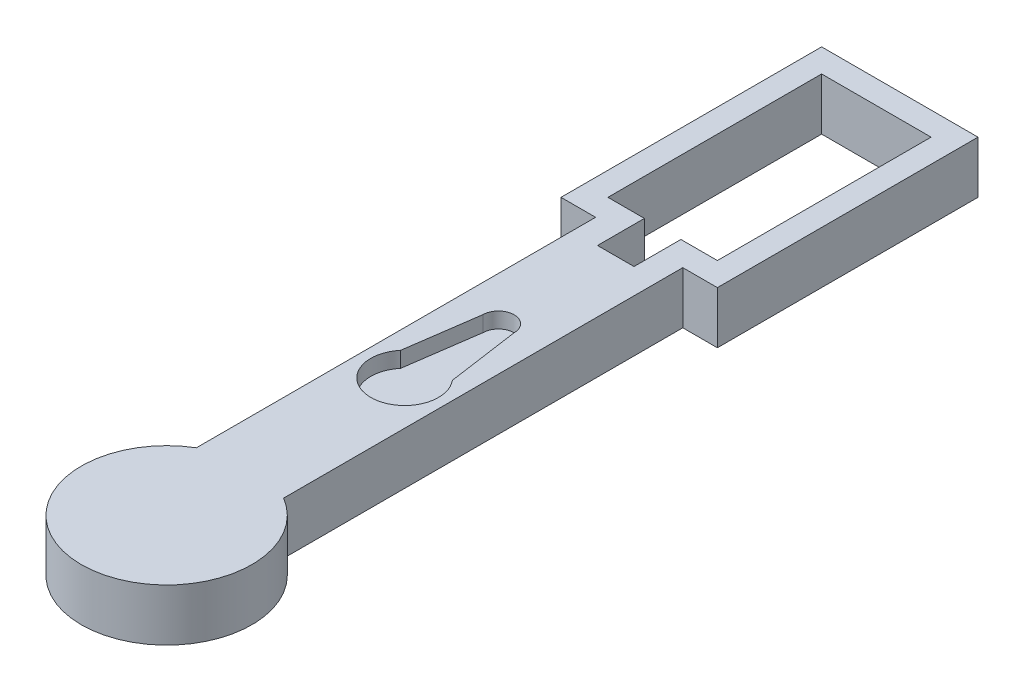
ISO-10303-21;
HEADER;
FILE_DESCRIPTION(('STEP AP214'),'2;1');
FILE_NAME('part.step','',(''),(''),'','','');
FILE_SCHEMA(('AUTOMOTIVE_DESIGN { 1 0 10303 214 1 1 1 1 }'));
ENDSEC;
DATA;
#1=APPLICATION_CONTEXT('core data for automotive mechanical design processes');
#2=APPLICATION_PROTOCOL_DEFINITION('international standard','automotive_design',2000,#1);
#3=PRODUCT_CONTEXT('',#1,'mechanical');
#4=PRODUCT('Part','Part','',(#3));
#5=PRODUCT_RELATED_PRODUCT_CATEGORY('part','',(#4));
#6=PRODUCT_DEFINITION_FORMATION('','',#4);
#7=PRODUCT_DEFINITION_CONTEXT('part definition',#1,'design');
#8=PRODUCT_DEFINITION('design','',#6,#7);
#9=PRODUCT_DEFINITION_SHAPE('','',#8);
#10=(LENGTH_UNIT() NAMED_UNIT(*) SI_UNIT(.MILLI.,.METRE.));
#11=(NAMED_UNIT(*) PLANE_ANGLE_UNIT() SI_UNIT($,.RADIAN.));
#12=(NAMED_UNIT(*) SI_UNIT($,.STERADIAN.) SOLID_ANGLE_UNIT());
#13=UNCERTAINTY_MEASURE_WITH_UNIT(LENGTH_MEASURE(1.E-05),#10,'distance_accuracy_value','');
#14=(GEOMETRIC_REPRESENTATION_CONTEXT(3) GLOBAL_UNCERTAINTY_ASSIGNED_CONTEXT((#13)) GLOBAL_UNIT_ASSIGNED_CONTEXT((#10,
#11,#12)) REPRESENTATION_CONTEXT('',''));
#15=CARTESIAN_POINT('',(0.,0.,0.));
#16=DIRECTION('',(0.,0.,1.));
#17=DIRECTION('',(1.,0.,0.));
#18=AXIS2_PLACEMENT_3D('',#15,#16,#17);
#19=CARTESIAN_POINT('',(8.36378985522402,10.,0.));
#20=DIRECTION('',(1.,0.,0.));
#21=DIRECTION('',(0.,0.,-1.));
#22=AXIS2_PLACEMENT_3D('',#19,#20,#21);
#23=PLANE('',#22);
#24=DIRECTION('',(0.,0.,1.));
#25=VECTOR('',#24,1.);
#26=CARTESIAN_POINT('',(8.36378985522402,0.,0.));
#27=LINE('',#26,#25);
#28=CARTESIAN_POINT('',(8.36378985522401,0.,-45.));
#29=VERTEX_POINT('',#28);
#30=CARTESIAN_POINT('',(8.36378985522402,0.,31.5906404654635));
#31=VERTEX_POINT('',#30);
#32=EDGE_CURVE('E285',#29,#31,#27,.T.);
#33=ORIENTED_EDGE('',*,*,#32,.F.);
#34=DIRECTION('',(0.,-1.,0.));
#35=VECTOR('',#34,1.);
#36=CARTESIAN_POINT('',(8.36378985522401,10.,-45.));
#37=LINE('',#36,#35);
#38=CARTESIAN_POINT('',(8.36378985522401,10.,-45.));
#39=VERTEX_POINT('',#38);
#40=EDGE_CURVE('E57',#39,#29,#37,.T.);
#41=ORIENTED_EDGE('',*,*,#40,.F.);
#42=DIRECTION('',(0.,0.,1.));
#43=VECTOR('',#42,1.);
#44=CARTESIAN_POINT('',(8.36378985522402,10.,0.));
#45=LINE('',#44,#43);
#46=CARTESIAN_POINT('',(8.36378985522402,10.,31.5906404654635));
#47=VERTEX_POINT('',#46);
#48=EDGE_CURVE('E277',#39,#47,#45,.T.);
#49=ORIENTED_EDGE('',*,*,#48,.T.);
#50=DIRECTION('',(0.,-1.,0.));
#51=VECTOR('',#50,1.);
#52=CARTESIAN_POINT('',(8.36378985522402,10.,31.5906404654635));
#53=LINE('',#52,#51);
#54=EDGE_CURVE('E12',#47,#31,#53,.T.);
#55=ORIENTED_EDGE('',*,*,#54,.T.);
#56=EDGE_LOOP('',(#33,#41,#49,#55));
#57=FACE_BOUND('',#56,.T.);
#58=ADVANCED_FACE('F48',(#57),#23,.T.);
#59=CARTESIAN_POINT('',(-8.36378985522402,10.,0.));
#60=DIRECTION('',(1.,0.,0.));
#61=DIRECTION('',(0.,0.,-1.));
#62=AXIS2_PLACEMENT_3D('',#59,#60,#61);
#63=PLANE('',#62);
#64=DIRECTION('',(0.,0.,1.));
#65=VECTOR('',#64,1.);
#66=CARTESIAN_POINT('',(-8.36378985522402,0.,0.));
#67=LINE('',#66,#65);
#68=CARTESIAN_POINT('',(-8.36378985522402,0.,-45.));
#69=VERTEX_POINT('',#68);
#70=CARTESIAN_POINT('',(-8.36378985522402,0.,31.5906404654635));
#71=VERTEX_POINT('',#70);
#72=EDGE_CURVE('E281',#69,#71,#67,.T.);
#73=ORIENTED_EDGE('',*,*,#72,.T.);
#74=DIRECTION('',(0.,-1.,0.));
#75=VECTOR('',#74,1.);
#76=CARTESIAN_POINT('',(-8.36378985522402,10.,31.5906404654635));
#77=LINE('',#76,#75);
#78=CARTESIAN_POINT('',(-8.36378985522402,10.,31.5906404654635));
#79=VERTEX_POINT('',#78);
#80=EDGE_CURVE('E284',#79,#71,#77,.T.);
#81=ORIENTED_EDGE('',*,*,#80,.F.);
#82=DIRECTION('',(0.,0.,1.));
#83=VECTOR('',#82,1.);
#84=CARTESIAN_POINT('',(-8.36378985522402,10.,0.));
#85=LINE('',#84,#83);
#86=CARTESIAN_POINT('',(-8.36378985522402,10.,-45.));
#87=VERTEX_POINT('',#86);
#88=EDGE_CURVE('E280',#87,#79,#85,.T.);
#89=ORIENTED_EDGE('',*,*,#88,.F.);
#90=DIRECTION('',(0.,-1.,0.));
#91=VECTOR('',#90,1.);
#92=CARTESIAN_POINT('',(-8.36378985522402,10.,-45.));
#93=LINE('',#92,#91);
#94=EDGE_CURVE('E292',#87,#69,#93,.T.);
#95=ORIENTED_EDGE('',*,*,#94,.T.);
#96=EDGE_LOOP('',(#73,#81,#89,#95));
#97=FACE_BOUND('',#96,.T.);
#98=ADVANCED_FACE('F360',(#97),#63,.F.);
#99=CARTESIAN_POINT('',(0.,0.,0.));
#100=DIRECTION('',(0.,1.,0.));
#101=DIRECTION('',(0.,0.,1.));
#102=AXIS2_PLACEMENT_3D('',#99,#100,#101);
#103=PLANE('',#102);
#104=DIRECTION('',(1.,0.,0.));
#105=VECTOR('',#104,1.);
#106=CARTESIAN_POINT('',(0.,0.,-40.5));
#107=LINE('',#106,#105);
#108=CARTESIAN_POINT('',(-3.50000000000001,0.,-40.5));
#109=VERTEX_POINT('',#108);
#110=CARTESIAN_POINT('',(3.49999999999999,0.,-40.5));
#111=VERTEX_POINT('',#110);
#112=EDGE_CURVE('E406',#109,#111,#107,.T.);
#113=ORIENTED_EDGE('',*,*,#112,.T.);
#114=DIRECTION('',(0.,0.,1.));
#115=VECTOR('',#114,1.);
#116=CARTESIAN_POINT('',(3.49999999999999,0.,0.));
#117=LINE('',#116,#115);
#118=CARTESIAN_POINT('',(3.49999999999999,0.,-49.5));
#119=VERTEX_POINT('',#118);
#120=EDGE_CURVE('E242',#119,#111,#117,.T.);
#121=ORIENTED_EDGE('',*,*,#120,.F.);
#122=DIRECTION('',(-1.,0.,0.));
#123=VECTOR('',#122,1.);
#124=CARTESIAN_POINT('',(10.5,0.,-49.5));
#125=LINE('',#124,#123);
#126=CARTESIAN_POINT('',(10.5,0.,-49.5));
#127=VERTEX_POINT('',#126);
#128=EDGE_CURVE('E194',#127,#119,#125,.T.);
#129=ORIENTED_EDGE('',*,*,#128,.F.);
#130=DIRECTION('',(0.,0.,1.));
#131=VECTOR('',#130,1.);
#132=CARTESIAN_POINT('',(10.5,0.,-90.5));
#133=LINE('',#132,#131);
#134=CARTESIAN_POINT('',(10.5,0.,-90.5));
#135=VERTEX_POINT('',#134);
#136=EDGE_CURVE('E231',#135,#127,#133,.T.);
#137=ORIENTED_EDGE('',*,*,#136,.F.);
#138=DIRECTION('',(-1.,0.,0.));
#139=VECTOR('',#138,1.);
#140=CARTESIAN_POINT('',(10.5,0.,-90.5));
#141=LINE('',#140,#139);
#142=CARTESIAN_POINT('',(-10.5,0.,-90.5));
#143=VERTEX_POINT('',#142);
#144=EDGE_CURVE('E223',#135,#143,#141,.T.);
#145=ORIENTED_EDGE('',*,*,#144,.T.);
#146=DIRECTION('',(0.,0.,1.));
#147=VECTOR('',#146,1.);
#148=CARTESIAN_POINT('',(-10.5,0.,-90.5));
#149=LINE('',#148,#147);
#150=CARTESIAN_POINT('',(-10.5,0.,-49.5));
#151=VERTEX_POINT('',#150);
#152=EDGE_CURVE('E226',#143,#151,#149,.T.);
#153=ORIENTED_EDGE('',*,*,#152,.T.);
#154=CARTESIAN_POINT('',(-3.50000000000001,0.,-49.5));
#155=VERTEX_POINT('',#154);
#156=EDGE_CURVE('E229',#155,#151,#125,.T.);
#157=ORIENTED_EDGE('',*,*,#156,.F.);
#158=DIRECTION('',(0.,0.,1.));
#159=VECTOR('',#158,1.);
#160=CARTESIAN_POINT('',(-3.50000000000001,0.,0.));
#161=LINE('',#160,#159);
#162=EDGE_CURVE('E65',#155,#109,#161,.T.);
#163=ORIENTED_EDGE('',*,*,#162,.T.);
#164=EDGE_LOOP('',(#113,#121,#129,#137,#145,#153,#157,#163));
#165=FACE_BOUND('',#164,.T.);
#166=ORIENTED_EDGE('',*,*,#32,.T.);
#167=CARTESIAN_POINT('',(0.,0.,45.6690209059487));
#168=DIRECTION('',(0.,1.,0.));
#169=DIRECTION('',(0.,0.,1.));
#170=AXIS2_PLACEMENT_3D('',#167,#168,#169);
#171=CIRCLE('',#170,16.3754015697138);
#172=EDGE_CURVE('E297',#71,#31,#171,.T.);
#173=ORIENTED_EDGE('',*,*,#172,.F.);
#174=ORIENTED_EDGE('',*,*,#72,.F.);
#175=DIRECTION('',(1.,0.,0.));
#176=VECTOR('',#175,1.);
#177=CARTESIAN_POINT('',(-15.,0.,-45.));
#178=LINE('',#177,#176);
#179=CARTESIAN_POINT('',(-15.,0.,-45.));
#180=VERTEX_POINT('',#179);
#181=EDGE_CURVE('E318',#180,#69,#178,.T.);
#182=ORIENTED_EDGE('',*,*,#181,.F.);
#183=DIRECTION('',(0.,0.,1.));
#184=VECTOR('',#183,1.);
#185=CARTESIAN_POINT('',(-15.,0.,-95.));
#186=LINE('',#185,#184);
#187=CARTESIAN_POINT('',(-15.,0.,-95.));
#188=VERTEX_POINT('',#187);
#189=EDGE_CURVE('E270',#188,#180,#186,.T.);
#190=ORIENTED_EDGE('',*,*,#189,.F.);
#191=DIRECTION('',(1.,0.,0.));
#192=VECTOR('',#191,1.);
#193=CARTESIAN_POINT('',(-15.,0.,-95.));
#194=LINE('',#193,#192);
#195=CARTESIAN_POINT('',(15.,0.,-95.));
#196=VERTEX_POINT('',#195);
#197=EDGE_CURVE('E304',#188,#196,#194,.T.);
#198=ORIENTED_EDGE('',*,*,#197,.T.);
#199=DIRECTION('',(0.,0.,1.));
#200=VECTOR('',#199,1.);
#201=CARTESIAN_POINT('',(15.,0.,-95.));
#202=LINE('',#201,#200);
#203=CARTESIAN_POINT('',(15.,0.,-45.));
#204=VERTEX_POINT('',#203);
#205=EDGE_CURVE('E321',#196,#204,#202,.T.);
#206=ORIENTED_EDGE('',*,*,#205,.T.);
#207=EDGE_CURVE('E317',#29,#204,#178,.T.);
#208=ORIENTED_EDGE('',*,*,#207,.F.);
#209=EDGE_LOOP('',(#166,#173,#174,#182,#190,#198,#206,#208));
#210=FACE_BOUND('',#209,.T.);
#211=ADVANCED_FACE('F343',(#165,#210),#103,.F.);
#212=CARTESIAN_POINT('',(0.,10.,0.));
#213=DIRECTION('',(0.,1.,0.));
#214=DIRECTION('',(0.,0.,1.));
#215=AXIS2_PLACEMENT_3D('',#212,#213,#214);
#216=PLANE('',#215);
#217=DIRECTION('',(0.,0.,1.));
#218=VECTOR('',#217,1.);
#219=CARTESIAN_POINT('',(3.49999999999999,10.,0.));
#220=LINE('',#219,#218);
#221=CARTESIAN_POINT('',(3.49999999999999,10.,-49.5));
#222=VERTEX_POINT('',#221);
#223=CARTESIAN_POINT('',(3.49999999999999,10.,-40.5));
#224=VERTEX_POINT('',#223);
#225=EDGE_CURVE('E203',#222,#224,#220,.T.);
#226=ORIENTED_EDGE('',*,*,#225,.T.);
#227=DIRECTION('',(1.,0.,0.));
#228=VECTOR('',#227,1.);
#229=CARTESIAN_POINT('',(0.,10.,-40.5));
#230=LINE('',#229,#228);
#231=CARTESIAN_POINT('',(-3.50000000000001,10.,-40.5));
#232=VERTEX_POINT('',#231);
#233=EDGE_CURVE('E207',#232,#224,#230,.T.);
#234=ORIENTED_EDGE('',*,*,#233,.F.);
#235=DIRECTION('',(0.,0.,1.));
#236=VECTOR('',#235,1.);
#237=CARTESIAN_POINT('',(-3.50000000000001,10.,0.));
#238=LINE('',#237,#236);
#239=CARTESIAN_POINT('',(-3.50000000000001,10.,-49.5));
#240=VERTEX_POINT('',#239);
#241=EDGE_CURVE('E199',#240,#232,#238,.T.);
#242=ORIENTED_EDGE('',*,*,#241,.F.);
#243=DIRECTION('',(-1.,0.,0.));
#244=VECTOR('',#243,1.);
#245=CARTESIAN_POINT('',(10.5,10.,-49.5));
#246=LINE('',#245,#244);
#247=CARTESIAN_POINT('',(-10.5,10.,-49.5));
#248=VERTEX_POINT('',#247);
#249=EDGE_CURVE('E214',#240,#248,#246,.T.);
#250=ORIENTED_EDGE('',*,*,#249,.T.);
#251=DIRECTION('',(0.,0.,1.));
#252=VECTOR('',#251,1.);
#253=CARTESIAN_POINT('',(-10.5,10.,-90.5));
#254=LINE('',#253,#252);
#255=CARTESIAN_POINT('',(-10.5,10.,-90.5));
#256=VERTEX_POINT('',#255);
#257=EDGE_CURVE('E219',#256,#248,#254,.T.);
#258=ORIENTED_EDGE('',*,*,#257,.F.);
#259=DIRECTION('',(-1.,0.,0.));
#260=VECTOR('',#259,1.);
#261=CARTESIAN_POINT('',(10.5,10.,-90.5));
#262=LINE('',#261,#260);
#263=CARTESIAN_POINT('',(10.5,10.,-90.5));
#264=VERTEX_POINT('',#263);
#265=EDGE_CURVE('E234',#264,#256,#262,.T.);
#266=ORIENTED_EDGE('',*,*,#265,.F.);
#267=DIRECTION('',(0.,0.,1.));
#268=VECTOR('',#267,1.);
#269=CARTESIAN_POINT('',(10.5,10.,-90.5));
#270=LINE('',#269,#268);
#271=CARTESIAN_POINT('',(10.5,10.,-49.5));
#272=VERTEX_POINT('',#271);
#273=EDGE_CURVE('E213',#264,#272,#270,.T.);
#274=ORIENTED_EDGE('',*,*,#273,.T.);
#275=EDGE_CURVE('E191',#272,#222,#246,.T.);
#276=ORIENTED_EDGE('',*,*,#275,.T.);
#277=EDGE_LOOP('',(#226,#234,#242,#250,#258,#266,#274,#276));
#278=FACE_BOUND('',#277,.T.);
#279=CARTESIAN_POINT('',(0.,10.,0.));
#280=DIRECTION('',(0.,1.,0.));
#281=DIRECTION('',(0.,0.,1.));
#282=AXIS2_PLACEMENT_3D('',#279,#280,#281);
#283=CIRCLE('',#282,6.50000000000007);
#284=CARTESIAN_POINT('',(-4.97435621961369,10.,-4.18399094171958));
#285=VERTEX_POINT('',#284);
#286=CARTESIAN_POINT('',(4.97435621961369,10.,-4.18399094171958));
#287=VERTEX_POINT('',#286);
#288=EDGE_CURVE('E257',#285,#287,#283,.T.);
#289=ORIENTED_EDGE('',*,*,#288,.F.);
#290=DIRECTION('',(-0.141111452705608,0.,0.989993716098902));
#291=VECTOR('',#290,1.);
#292=CARTESIAN_POINT('',(-2.99977106704246,10.,-18.0370613726926));
#293=LINE('',#292,#291);
#294=CARTESIAN_POINT('',(-2.99977106704246,10.,-18.0370613726926));
#295=VERTEX_POINT('',#294);
#296=EDGE_CURVE('E247',#295,#285,#293,.T.);
#297=ORIENTED_EDGE('',*,*,#296,.F.);
#298=CARTESIAN_POINT('',(0.,10.,-18.));
#299=DIRECTION('',(0.,1.,0.));
#300=DIRECTION('',(0.,0.,1.));
#301=AXIS2_PLACEMENT_3D('',#298,#299,#300);
#302=CIRCLE('',#301,3.00000000000182);
#303=CARTESIAN_POINT('',(2.99977106704246,10.,-18.0370613726926));
#304=VERTEX_POINT('',#303);
#305=EDGE_CURVE('E263',#304,#295,#302,.T.);
#306=ORIENTED_EDGE('',*,*,#305,.F.);
#307=DIRECTION('',(-0.141111452705608,0.,-0.989993716098902));
#308=VECTOR('',#307,1.);
#309=CARTESIAN_POINT('',(4.97435621961369,10.,-4.18399094171958));
#310=LINE('',#309,#308);
#311=EDGE_CURVE('E259',#287,#304,#310,.T.);
#312=ORIENTED_EDGE('',*,*,#311,.F.);
#313=EDGE_LOOP('',(#289,#297,#306,#312));
#314=FACE_BOUND('',#313,.T.);
#315=ORIENTED_EDGE('',*,*,#88,.T.);
#316=CARTESIAN_POINT('',(0.,10.,45.6690209059487));
#317=DIRECTION('',(0.,1.,0.));
#318=DIRECTION('',(0.,0.,1.));
#319=AXIS2_PLACEMENT_3D('',#316,#317,#318);
#320=CIRCLE('',#319,16.3754015697138);
#321=EDGE_CURVE('E288',#79,#47,#320,.T.);
#322=ORIENTED_EDGE('',*,*,#321,.T.);
#323=ORIENTED_EDGE('',*,*,#48,.F.);
#324=DIRECTION('',(1.,0.,0.));
#325=VECTOR('',#324,1.);
#326=CARTESIAN_POINT('',(-15.,10.,-45.));
#327=LINE('',#326,#325);
#328=CARTESIAN_POINT('',(15.,10.,-45.));
#329=VERTEX_POINT('',#328);
#330=EDGE_CURVE('E303',#39,#329,#327,.T.);
#331=ORIENTED_EDGE('',*,*,#330,.T.);
#332=DIRECTION('',(0.,0.,1.));
#333=VECTOR('',#332,1.);
#334=CARTESIAN_POINT('',(15.,10.,-95.));
#335=LINE('',#334,#333);
#336=CARTESIAN_POINT('',(15.,10.,-95.));
#337=VERTEX_POINT('',#336);
#338=EDGE_CURVE('E308',#337,#329,#335,.T.);
#339=ORIENTED_EDGE('',*,*,#338,.F.);
#340=DIRECTION('',(1.,0.,0.));
#341=VECTOR('',#340,1.);
#342=CARTESIAN_POINT('',(-15.,10.,-95.));
#343=LINE('',#342,#341);
#344=CARTESIAN_POINT('',(-15.,10.,-95.));
#345=VERTEX_POINT('',#344);
#346=EDGE_CURVE('E311',#345,#337,#343,.T.);
#347=ORIENTED_EDGE('',*,*,#346,.F.);
#348=DIRECTION('',(0.,0.,1.));
#349=VECTOR('',#348,1.);
#350=CARTESIAN_POINT('',(-15.,10.,-95.));
#351=LINE('',#350,#349);
#352=CARTESIAN_POINT('',(-15.,10.,-45.));
#353=VERTEX_POINT('',#352);
#354=EDGE_CURVE('E300',#345,#353,#351,.T.);
#355=ORIENTED_EDGE('',*,*,#354,.T.);
#356=EDGE_CURVE('E305',#353,#87,#327,.T.);
#357=ORIENTED_EDGE('',*,*,#356,.T.);
#358=EDGE_LOOP('',(#315,#322,#323,#331,#339,#347,#355,#357));
#359=FACE_BOUND('',#358,.T.);
#360=ADVANCED_FACE('F209',(#278,#314,#359),#216,.T.);
#361=CARTESIAN_POINT('',(0.,10.,45.6690209059487));
#362=DIRECTION('',(0.,-1.,0.));
#363=DIRECTION('',(0.,0.,-1.));
#364=AXIS2_PLACEMENT_3D('',#361,#362,#363);
#365=CYLINDRICAL_SURFACE('',#364,16.3754015697138);
#366=ORIENTED_EDGE('',*,*,#54,.F.);
#367=ORIENTED_EDGE('',*,*,#321,.F.);
#368=ORIENTED_EDGE('',*,*,#80,.T.);
#369=ORIENTED_EDGE('',*,*,#172,.T.);
#370=EDGE_LOOP('',(#366,#367,#368,#369));
#371=FACE_BOUND('',#370,.T.);
#372=ADVANCED_FACE('F358',(#371),#365,.T.);
#373=CARTESIAN_POINT('',(-15.,10.,-95.));
#374=DIRECTION('',(0.,0.,-1.));
#375=DIRECTION('',(-1.,0.,0.));
#376=AXIS2_PLACEMENT_3D('',#373,#374,#375);
#377=PLANE('',#376);
#378=ORIENTED_EDGE('',*,*,#197,.F.);
#379=DIRECTION('',(0.,-1.,0.));
#380=VECTOR('',#379,1.);
#381=CARTESIAN_POINT('',(-15.,10.,-95.));
#382=LINE('',#381,#380);
#383=EDGE_CURVE('E314',#345,#188,#382,.T.);
#384=ORIENTED_EDGE('',*,*,#383,.F.);
#385=ORIENTED_EDGE('',*,*,#346,.T.);
#386=DIRECTION('',(0.,-1.,0.));
#387=VECTOR('',#386,1.);
#388=CARTESIAN_POINT('',(15.,10.,-95.));
#389=LINE('',#388,#387);
#390=EDGE_CURVE('E327',#337,#196,#389,.T.);
#391=ORIENTED_EDGE('',*,*,#390,.T.);
#392=EDGE_LOOP('',(#378,#384,#385,#391));
#393=FACE_BOUND('',#392,.T.);
#394=ADVANCED_FACE('F345',(#393),#377,.T.);
#395=CARTESIAN_POINT('',(-15.,10.,-95.));
#396=DIRECTION('',(1.,0.,0.));
#397=DIRECTION('',(0.,0.,-1.));
#398=AXIS2_PLACEMENT_3D('',#395,#396,#397);
#399=PLANE('',#398);
#400=ORIENTED_EDGE('',*,*,#189,.T.);
#401=DIRECTION('',(0.,-1.,0.));
#402=VECTOR('',#401,1.);
#403=CARTESIAN_POINT('',(-15.,10.,-45.));
#404=LINE('',#403,#402);
#405=EDGE_CURVE('E52',#353,#180,#404,.T.);
#406=ORIENTED_EDGE('',*,*,#405,.F.);
#407=ORIENTED_EDGE('',*,*,#354,.F.);
#408=ORIENTED_EDGE('',*,*,#383,.T.);
#409=EDGE_LOOP('',(#400,#406,#407,#408));
#410=FACE_BOUND('',#409,.T.);
#411=ADVANCED_FACE('F50',(#410),#399,.F.);
#412=CARTESIAN_POINT('',(15.,10.,-95.));
#413=DIRECTION('',(1.,0.,0.));
#414=DIRECTION('',(0.,0.,-1.));
#415=AXIS2_PLACEMENT_3D('',#412,#413,#414);
#416=PLANE('',#415);
#417=ORIENTED_EDGE('',*,*,#205,.F.);
#418=ORIENTED_EDGE('',*,*,#390,.F.);
#419=ORIENTED_EDGE('',*,*,#338,.T.);
#420=DIRECTION('',(0.,-1.,0.));
#421=VECTOR('',#420,1.);
#422=CARTESIAN_POINT('',(15.,10.,-45.));
#423=LINE('',#422,#421);
#424=EDGE_CURVE('E328',#329,#204,#423,.T.);
#425=ORIENTED_EDGE('',*,*,#424,.T.);
#426=EDGE_LOOP('',(#417,#418,#419,#425));
#427=FACE_BOUND('',#426,.T.);
#428=ADVANCED_FACE('F348',(#427),#416,.T.);
#429=CARTESIAN_POINT('',(-15.,10.,-45.));
#430=DIRECTION('',(0.,0.,-1.));
#431=DIRECTION('',(-1.,0.,0.));
#432=AXIS2_PLACEMENT_3D('',#429,#430,#431);
#433=PLANE('',#432);
#434=ORIENTED_EDGE('',*,*,#330,.F.);
#435=ORIENTED_EDGE('',*,*,#40,.T.);
#436=ORIENTED_EDGE('',*,*,#207,.T.);
#437=ORIENTED_EDGE('',*,*,#424,.F.);
#438=EDGE_LOOP('',(#434,#435,#436,#437));
#439=FACE_BOUND('',#438,.T.);
#440=ADVANCED_FACE('F363',(#439),#433,.F.);
#441=ORIENTED_EDGE('',*,*,#94,.F.);
#442=ORIENTED_EDGE('',*,*,#356,.F.);
#443=ORIENTED_EDGE('',*,*,#405,.T.);
#444=ORIENTED_EDGE('',*,*,#181,.T.);
#445=EDGE_LOOP('',(#441,#442,#443,#444));
#446=FACE_BOUND('',#445,.T.);
#447=ADVANCED_FACE('F336',(#446),#433,.F.);
#448=CARTESIAN_POINT('',(0.,7.,0.));
#449=DIRECTION('',(0.,1.,0.));
#450=DIRECTION('',(0.,0.,1.));
#451=AXIS2_PLACEMENT_3D('',#448,#449,#450);
#452=CYLINDRICAL_SURFACE('',#451,6.50000000000007);
#453=ORIENTED_EDGE('',*,*,#288,.T.);
#454=DIRECTION('',(0.,1.,0.));
#455=VECTOR('',#454,1.);
#456=CARTESIAN_POINT('',(4.97435621961369,7.,-4.18399094171958));
#457=LINE('',#456,#455);
#458=CARTESIAN_POINT('',(4.97435621961369,7.,-4.18399094171958));
#459=VERTEX_POINT('',#458);
#460=EDGE_CURVE('E256',#459,#287,#457,.T.);
#461=ORIENTED_EDGE('',*,*,#460,.F.);
#462=CARTESIAN_POINT('',(0.,7.,0.));
#463=DIRECTION('',(0.,1.,0.));
#464=DIRECTION('',(0.,0.,1.));
#465=AXIS2_PLACEMENT_3D('',#462,#463,#464);
#466=CIRCLE('',#465,6.50000000000007);
#467=CARTESIAN_POINT('',(-4.97435621961369,7.,-4.18399094171958));
#468=VERTEX_POINT('',#467);
#469=EDGE_CURVE('E243',#468,#459,#466,.T.);
#470=ORIENTED_EDGE('',*,*,#469,.F.);
#471=DIRECTION('',(0.,1.,0.));
#472=VECTOR('',#471,1.);
#473=CARTESIAN_POINT('',(-4.97435621961369,7.,-4.18399094171958));
#474=LINE('',#473,#472);
#475=EDGE_CURVE('E268',#468,#285,#474,.T.);
#476=ORIENTED_EDGE('',*,*,#475,.T.);
#477=EDGE_LOOP('',(#453,#461,#470,#476));
#478=FACE_BOUND('',#477,.T.);
#479=ADVANCED_FACE('F369',(#478),#452,.F.);
#480=CARTESIAN_POINT('',(-2.99977106704246,7.,-18.0370613726926));
#481=DIRECTION('',(-0.989993716098902,0.,-0.141111452705608));
#482=DIRECTION('',(-0.141111452705608,0.,0.989993716098902));
#483=AXIS2_PLACEMENT_3D('',#480,#481,#482);
#484=PLANE('',#483);
#485=ORIENTED_EDGE('',*,*,#296,.T.);
#486=ORIENTED_EDGE('',*,*,#475,.F.);
#487=DIRECTION('',(-0.141111452705608,0.,0.989993716098902));
#488=VECTOR('',#487,1.);
#489=CARTESIAN_POINT('',(-2.99977106704246,7.,-18.0370613726926));
#490=LINE('',#489,#488);
#491=CARTESIAN_POINT('',(-2.99977106704246,7.,-18.0370613726926));
#492=VERTEX_POINT('',#491);
#493=EDGE_CURVE('E253',#492,#468,#490,.T.);
#494=ORIENTED_EDGE('',*,*,#493,.F.);
#495=DIRECTION('',(0.,1.,0.));
#496=VECTOR('',#495,1.);
#497=CARTESIAN_POINT('',(-2.99977106704246,7.,-18.0370613726926));
#498=LINE('',#497,#496);
#499=EDGE_CURVE('E271',#492,#295,#498,.T.);
#500=ORIENTED_EDGE('',*,*,#499,.T.);
#501=EDGE_LOOP('',(#485,#486,#494,#500));
#502=FACE_BOUND('',#501,.T.);
#503=ADVANCED_FACE('F386',(#502),#484,.F.);
#504=CARTESIAN_POINT('',(0.,7.,-18.));
#505=DIRECTION('',(0.,1.,0.));
#506=DIRECTION('',(0.,0.,1.));
#507=AXIS2_PLACEMENT_3D('',#504,#505,#506);
#508=CYLINDRICAL_SURFACE('',#507,3.00000000000182);
#509=ORIENTED_EDGE('',*,*,#305,.T.);
#510=ORIENTED_EDGE('',*,*,#499,.F.);
#511=CARTESIAN_POINT('',(0.,7.,-18.));
#512=DIRECTION('',(0.,1.,0.));
#513=DIRECTION('',(0.,0.,1.));
#514=AXIS2_PLACEMENT_3D('',#511,#512,#513);
#515=CIRCLE('',#514,3.00000000000182);
#516=CARTESIAN_POINT('',(2.99977106704246,7.,-18.0370613726926));
#517=VERTEX_POINT('',#516);
#518=EDGE_CURVE('E250',#517,#492,#515,.T.);
#519=ORIENTED_EDGE('',*,*,#518,.F.);
#520=DIRECTION('',(0.,1.,0.));
#521=VECTOR('',#520,1.);
#522=CARTESIAN_POINT('',(2.99977106704246,7.,-18.0370613726926));
#523=LINE('',#522,#521);
#524=EDGE_CURVE('E273',#517,#304,#523,.T.);
#525=ORIENTED_EDGE('',*,*,#524,.T.);
#526=EDGE_LOOP('',(#509,#510,#519,#525));
#527=FACE_BOUND('',#526,.T.);
#528=ADVANCED_FACE('F392',(#527),#508,.F.);
#529=CARTESIAN_POINT('',(4.97435621961369,7.,-4.18399094171958));
#530=DIRECTION('',(0.989993716098902,0.,-0.141111452705608));
#531=DIRECTION('',(-0.141111452705608,0.,-0.989993716098902));
#532=AXIS2_PLACEMENT_3D('',#529,#530,#531);
#533=PLANE('',#532);
#534=ORIENTED_EDGE('',*,*,#311,.T.);
#535=ORIENTED_EDGE('',*,*,#524,.F.);
#536=DIRECTION('',(-0.141111452705608,0.,-0.989993716098902));
#537=VECTOR('',#536,1.);
#538=CARTESIAN_POINT('',(4.97435621961369,7.,-4.18399094171958));
#539=LINE('',#538,#537);
#540=EDGE_CURVE('E246',#459,#517,#539,.T.);
#541=ORIENTED_EDGE('',*,*,#540,.F.);
#542=ORIENTED_EDGE('',*,*,#460,.T.);
#543=EDGE_LOOP('',(#534,#535,#541,#542));
#544=FACE_BOUND('',#543,.T.);
#545=ADVANCED_FACE('F397',(#544),#533,.F.);
#546=CARTESIAN_POINT('',(0.,7.,0.));
#547=DIRECTION('',(0.,1.,0.));
#548=DIRECTION('',(0.,0.,1.));
#549=AXIS2_PLACEMENT_3D('',#546,#547,#548);
#550=PLANE('',#549);
#551=ORIENTED_EDGE('',*,*,#469,.T.);
#552=ORIENTED_EDGE('',*,*,#540,.T.);
#553=ORIENTED_EDGE('',*,*,#518,.T.);
#554=ORIENTED_EDGE('',*,*,#493,.T.);
#555=EDGE_LOOP('',(#551,#552,#553,#554));
#556=FACE_BOUND('',#555,.T.);
#557=ADVANCED_FACE('F442',(#556),#550,.T.);
#558=CARTESIAN_POINT('',(-3.50000000000001,10.,0.));
#559=DIRECTION('',(1.,0.,0.));
#560=DIRECTION('',(0.,0.,-1.));
#561=AXIS2_PLACEMENT_3D('',#558,#559,#560);
#562=PLANE('',#561);
#563=ORIENTED_EDGE('',*,*,#162,.F.);
#564=DIRECTION('',(0.,-1.,0.));
#565=VECTOR('',#564,1.);
#566=CARTESIAN_POINT('',(-3.50000000000001,10.,-49.5));
#567=LINE('',#566,#565);
#568=EDGE_CURVE('E260',#240,#155,#567,.T.);
#569=ORIENTED_EDGE('',*,*,#568,.F.);
#570=ORIENTED_EDGE('',*,*,#241,.T.);
#571=DIRECTION('',(0.,-1.,0.));
#572=VECTOR('',#571,1.);
#573=CARTESIAN_POINT('',(-3.50000000000001,10.,-40.5));
#574=LINE('',#573,#572);
#575=EDGE_CURVE('E416',#232,#109,#574,.T.);
#576=ORIENTED_EDGE('',*,*,#575,.T.);
#577=EDGE_LOOP('',(#563,#569,#570,#576));
#578=FACE_BOUND('',#577,.T.);
#579=ADVANCED_FACE('F432',(#578),#562,.T.);
#580=CARTESIAN_POINT('',(0.,10.,-40.5));
#581=DIRECTION('',(0.,0.,-1.));
#582=DIRECTION('',(-1.,0.,0.));
#583=AXIS2_PLACEMENT_3D('',#580,#581,#582);
#584=PLANE('',#583);
#585=ORIENTED_EDGE('',*,*,#112,.F.);
#586=ORIENTED_EDGE('',*,*,#575,.F.);
#587=ORIENTED_EDGE('',*,*,#233,.T.);
#588=DIRECTION('',(0.,-1.,0.));
#589=VECTOR('',#588,1.);
#590=CARTESIAN_POINT('',(3.49999999999999,10.,-40.5));
#591=LINE('',#590,#589);
#592=EDGE_CURVE('E198',#224,#111,#591,.T.);
#593=ORIENTED_EDGE('',*,*,#592,.T.);
#594=EDGE_LOOP('',(#585,#586,#587,#593));
#595=FACE_BOUND('',#594,.T.);
#596=ADVANCED_FACE('F441',(#595),#584,.T.);
#597=CARTESIAN_POINT('',(3.49999999999999,10.,0.));
#598=DIRECTION('',(1.,0.,0.));
#599=DIRECTION('',(0.,0.,-1.));
#600=AXIS2_PLACEMENT_3D('',#597,#598,#599);
#601=PLANE('',#600);
#602=ORIENTED_EDGE('',*,*,#120,.T.);
#603=ORIENTED_EDGE('',*,*,#592,.F.);
#604=ORIENTED_EDGE('',*,*,#225,.F.);
#605=DIRECTION('',(0.,-1.,0.));
#606=VECTOR('',#605,1.);
#607=CARTESIAN_POINT('',(3.49999999999999,10.,-49.5));
#608=LINE('',#607,#606);
#609=EDGE_CURVE('E187',#222,#119,#608,.T.);
#610=ORIENTED_EDGE('',*,*,#609,.T.);
#611=EDGE_LOOP('',(#602,#603,#604,#610));
#612=FACE_BOUND('',#611,.T.);
#613=ADVANCED_FACE('F204',(#612),#601,.F.);
#614=CARTESIAN_POINT('',(10.5,10.,-90.5));
#615=DIRECTION('',(0.,0.,1.));
#616=DIRECTION('',(1.,0.,0.));
#617=AXIS2_PLACEMENT_3D('',#614,#615,#616);
#618=PLANE('',#617);
#619=ORIENTED_EDGE('',*,*,#144,.F.);
#620=DIRECTION('',(0.,-1.,0.));
#621=VECTOR('',#620,1.);
#622=CARTESIAN_POINT('',(10.5,10.,-90.5));
#623=LINE('',#622,#621);
#624=EDGE_CURVE('E216',#264,#135,#623,.T.);
#625=ORIENTED_EDGE('',*,*,#624,.F.);
#626=ORIENTED_EDGE('',*,*,#265,.T.);
#627=DIRECTION('',(0.,-1.,0.));
#628=VECTOR('',#627,1.);
#629=CARTESIAN_POINT('',(-10.5,10.,-90.5));
#630=LINE('',#629,#628);
#631=EDGE_CURVE('E239',#256,#143,#630,.T.);
#632=ORIENTED_EDGE('',*,*,#631,.T.);
#633=EDGE_LOOP('',(#619,#625,#626,#632));
#634=FACE_BOUND('',#633,.T.);
#635=ADVANCED_FACE('F427',(#634),#618,.T.);
#636=CARTESIAN_POINT('',(-10.5,10.,-90.5));
#637=DIRECTION('',(1.,0.,0.));
#638=DIRECTION('',(0.,0.,-1.));
#639=AXIS2_PLACEMENT_3D('',#636,#637,#638);
#640=PLANE('',#639);
#641=ORIENTED_EDGE('',*,*,#152,.F.);
#642=ORIENTED_EDGE('',*,*,#631,.F.);
#643=ORIENTED_EDGE('',*,*,#257,.T.);
#644=DIRECTION('',(0.,-1.,0.));
#645=VECTOR('',#644,1.);
#646=CARTESIAN_POINT('',(-10.5,10.,-49.5));
#647=LINE('',#646,#645);
#648=EDGE_CURVE('E73',#248,#151,#647,.T.);
#649=ORIENTED_EDGE('',*,*,#648,.T.);
#650=EDGE_LOOP('',(#641,#642,#643,#649));
#651=FACE_BOUND('',#650,.T.);
#652=ADVANCED_FACE('F422',(#651),#640,.T.);
#653=CARTESIAN_POINT('',(10.5,10.,-90.5));
#654=DIRECTION('',(1.,0.,0.));
#655=DIRECTION('',(0.,0.,-1.));
#656=AXIS2_PLACEMENT_3D('',#653,#654,#655);
#657=PLANE('',#656);
#658=ORIENTED_EDGE('',*,*,#136,.T.);
#659=DIRECTION('',(0.,-1.,0.));
#660=VECTOR('',#659,1.);
#661=CARTESIAN_POINT('',(10.5,10.,-49.5));
#662=LINE('',#661,#660);
#663=EDGE_CURVE('E236',#272,#127,#662,.T.);
#664=ORIENTED_EDGE('',*,*,#663,.F.);
#665=ORIENTED_EDGE('',*,*,#273,.F.);
#666=ORIENTED_EDGE('',*,*,#624,.T.);
#667=EDGE_LOOP('',(#658,#664,#665,#666));
#668=FACE_BOUND('',#667,.T.);
#669=ADVANCED_FACE('F429',(#668),#657,.F.);
#670=CARTESIAN_POINT('',(10.5,10.,-49.5));
#671=DIRECTION('',(0.,0.,1.));
#672=DIRECTION('',(1.,0.,0.));
#673=AXIS2_PLACEMENT_3D('',#670,#671,#672);
#674=PLANE('',#673);
#675=ORIENTED_EDGE('',*,*,#275,.F.);
#676=ORIENTED_EDGE('',*,*,#663,.T.);
#677=ORIENTED_EDGE('',*,*,#128,.T.);
#678=ORIENTED_EDGE('',*,*,#609,.F.);
#679=EDGE_LOOP('',(#675,#676,#677,#678));
#680=FACE_BOUND('',#679,.T.);
#681=ADVANCED_FACE('F189',(#680),#674,.F.);
#682=ORIENTED_EDGE('',*,*,#568,.T.);
#683=ORIENTED_EDGE('',*,*,#156,.T.);
#684=ORIENTED_EDGE('',*,*,#648,.F.);
#685=ORIENTED_EDGE('',*,*,#249,.F.);
#686=EDGE_LOOP('',(#682,#683,#684,#685));
#687=FACE_BOUND('',#686,.T.);
#688=ADVANCED_FACE('F424',(#687),#674,.F.);
#689=CLOSED_SHELL('',(#58,#98,#211,#360,#372,#394,#411,#428,#440,#447,#479,#503,#528,#545,#557,
#579,#596,#613,#635,#652,#669,#681,#688));
#690=MANIFOLD_SOLID_BREP('B2',#689);
#691=ADVANCED_BREP_SHAPE_REPRESENTATION('',(#18,#690),#14);
#692=SHAPE_DEFINITION_REPRESENTATION(#9,#691);
ENDSEC;
END-ISO-10303-21;
